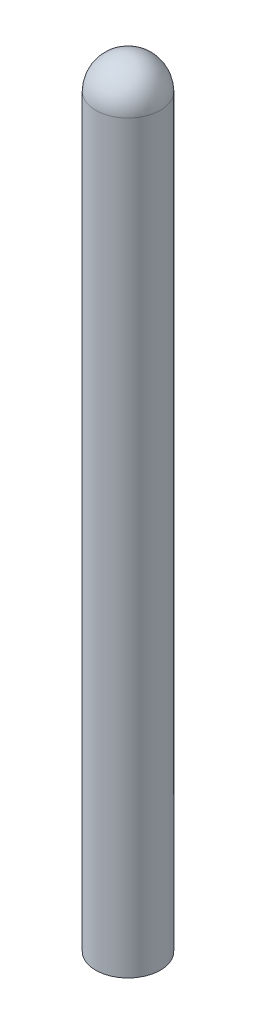
ISO-10303-21;
HEADER;
FILE_DESCRIPTION(('STEP AP214'),'2;1');
FILE_NAME('part.step','',(''),(''),'','','');
FILE_SCHEMA(('AUTOMOTIVE_DESIGN { 1 0 10303 214 1 1 1 1 }'));
ENDSEC;
DATA;
#1=APPLICATION_CONTEXT('core data for automotive mechanical design processes');
#2=APPLICATION_PROTOCOL_DEFINITION('international standard','automotive_design',2000,#1);
#3=PRODUCT_CONTEXT('',#1,'mechanical');
#4=PRODUCT('Part','Part','',(#3));
#5=PRODUCT_RELATED_PRODUCT_CATEGORY('part','',(#4));
#6=PRODUCT_DEFINITION_FORMATION('','',#4);
#7=PRODUCT_DEFINITION_CONTEXT('part definition',#1,'design');
#8=PRODUCT_DEFINITION('design','',#6,#7);
#9=PRODUCT_DEFINITION_SHAPE('','',#8);
#10=(LENGTH_UNIT() NAMED_UNIT(*) SI_UNIT(.MILLI.,.METRE.));
#11=(NAMED_UNIT(*) PLANE_ANGLE_UNIT() SI_UNIT($,.RADIAN.));
#12=(NAMED_UNIT(*) SI_UNIT($,.STERADIAN.) SOLID_ANGLE_UNIT());
#13=UNCERTAINTY_MEASURE_WITH_UNIT(LENGTH_MEASURE(1.E-05),#10,'distance_accuracy_value','');
#14=(GEOMETRIC_REPRESENTATION_CONTEXT(3) GLOBAL_UNCERTAINTY_ASSIGNED_CONTEXT((#13)) GLOBAL_UNIT_ASSIGNED_CONTEXT((#10,
#11,#12)) REPRESENTATION_CONTEXT('',''));
#15=CARTESIAN_POINT('',(0.,0.,0.));
#16=DIRECTION('',(0.,0.,1.));
#17=DIRECTION('',(1.,0.,0.));
#18=AXIS2_PLACEMENT_3D('',#15,#16,#17);
#19=CARTESIAN_POINT('',(0.,76.2,0.));
#20=DIRECTION('',(0.,-1.,0.));
#21=DIRECTION('',(0.,0.,-1.));
#22=AXIS2_PLACEMENT_3D('',#19,#20,#21);
#23=CYLINDRICAL_SURFACE('',#22,3.175);
#24=CARTESIAN_POINT('',(0.,73.025,0.));
#25=DIRECTION('',(0.,-1.,0.));
#26=DIRECTION('',(0.,0.,-1.));
#27=AXIS2_PLACEMENT_3D('',#24,#25,#26);
#28=CIRCLE('',#27,3.175);
#29=CARTESIAN_POINT('',(0.,73.025,-3.175));
#30=VERTEX_POINT('',#29);
#31=EDGE_CURVE('E10',#30,#30,#28,.T.);
#32=CARTESIAN_POINT('',(0.,0.,0.));
#33=DIRECTION('',(0.,1.,0.));
#34=DIRECTION('',(0.,0.,1.));
#35=AXIS2_PLACEMENT_3D('',#32,#33,#34);
#36=CIRCLE('',#35,3.175);
#37=CARTESIAN_POINT('',(0.,0.,-3.175));
#38=VERTEX_POINT('',#37);
#39=EDGE_CURVE('E38',#38,#38,#36,.T.);
#40=CARTESIAN_POINT('',(0.,73.025,-3.175));
#41=CARTESIAN_POINT('',(0.,72.2643229166667,-3.175));
#42=CARTESIAN_POINT('',(0.,71.5036458333334,-3.175));
#43=CARTESIAN_POINT('',(0.,69.9822916666667,-3.175));
#44=CARTESIAN_POINT('',(0.,69.2216145833333,-3.175));
#45=CARTESIAN_POINT('',(0.,67.7002604166667,-3.175));
#46=CARTESIAN_POINT('',(0.,66.9395833333333,-3.175));
#47=CARTESIAN_POINT('',(0.,65.4182291666667,-3.175));
#48=CARTESIAN_POINT('',(0.,64.6575520833333,-3.175));
#49=CARTESIAN_POINT('',(0.,63.1361979166667,-3.175));
#50=CARTESIAN_POINT('',(0.,62.3755208333333,-3.175));
#51=CARTESIAN_POINT('',(0.,60.8541666666667,-3.175));
#52=CARTESIAN_POINT('',(0.,60.0934895833333,-3.175));
#53=CARTESIAN_POINT('',(0.,58.5721354166667,-3.175));
#54=CARTESIAN_POINT('',(0.,57.8114583333333,-3.175));
#55=CARTESIAN_POINT('',(0.,56.2901041666667,-3.175));
#56=CARTESIAN_POINT('',(0.,55.5294270833333,-3.175));
#57=CARTESIAN_POINT('',(0.,54.0080729166667,-3.175));
#58=CARTESIAN_POINT('',(0.,53.2473958333333,-3.175));
#59=CARTESIAN_POINT('',(0.,51.7260416666667,-3.175));
#60=CARTESIAN_POINT('',(0.,50.9653645833333,-3.175));
#61=CARTESIAN_POINT('',(0.,49.4440104166667,-3.175));
#62=CARTESIAN_POINT('',(0.,48.6833333333333,-3.175));
#63=CARTESIAN_POINT('',(0.,47.1619791666667,-3.175));
#64=CARTESIAN_POINT('',(0.,46.4013020833333,-3.175));
#65=CARTESIAN_POINT('',(0.,44.8799479166667,-3.175));
#66=CARTESIAN_POINT('',(0.,44.1192708333333,-3.175));
#67=CARTESIAN_POINT('',(0.,42.5979166666667,-3.175));
#68=CARTESIAN_POINT('',(0.,41.8372395833333,-3.175));
#69=CARTESIAN_POINT('',(0.,40.3158854166667,-3.175));
#70=CARTESIAN_POINT('',(0.,39.5552083333333,-3.175));
#71=CARTESIAN_POINT('',(0.,38.0338541666667,-3.175));
#72=CARTESIAN_POINT('',(0.,37.2731770833333,-3.175));
#73=CARTESIAN_POINT('',(0.,35.7518229166667,-3.175));
#74=CARTESIAN_POINT('',(0.,34.9911458333333,-3.175));
#75=CARTESIAN_POINT('',(0.,33.4697916666667,-3.175));
#76=CARTESIAN_POINT('',(0.,32.7091145833333,-3.175));
#77=CARTESIAN_POINT('',(0.,31.1877604166667,-3.175));
#78=CARTESIAN_POINT('',(0.,30.4270833333333,-3.175));
#79=CARTESIAN_POINT('',(0.,28.9057291666667,-3.175));
#80=CARTESIAN_POINT('',(0.,28.1450520833333,-3.175));
#81=CARTESIAN_POINT('',(0.,26.6236979166667,-3.175));
#82=CARTESIAN_POINT('',(0.,25.8630208333333,-3.175));
#83=CARTESIAN_POINT('',(0.,24.3416666666667,-3.175));
#84=CARTESIAN_POINT('',(0.,23.5809895833333,-3.175));
#85=CARTESIAN_POINT('',(0.,22.0596354166667,-3.175));
#86=CARTESIAN_POINT('',(0.,21.2989583333333,-3.175));
#87=CARTESIAN_POINT('',(0.,19.7776041666667,-3.175));
#88=CARTESIAN_POINT('',(0.,19.0169270833333,-3.175));
#89=CARTESIAN_POINT('',(0.,17.4955729166667,-3.175));
#90=CARTESIAN_POINT('',(0.,16.7348958333333,-3.175));
#91=CARTESIAN_POINT('',(0.,15.2135416666667,-3.175));
#92=CARTESIAN_POINT('',(0.,14.4528645833333,-3.175));
#93=CARTESIAN_POINT('',(0.,12.9315104166667,-3.175));
#94=CARTESIAN_POINT('',(0.,12.1708333333333,-3.175));
#95=CARTESIAN_POINT('',(0.,10.6494791666667,-3.175));
#96=CARTESIAN_POINT('',(0.,9.88880208333332,-3.175));
#97=CARTESIAN_POINT('',(0.,8.36744791666666,-3.175));
#98=CARTESIAN_POINT('',(0.,7.60677083333333,-3.175));
#99=CARTESIAN_POINT('',(0.,6.08541666666667,-3.175));
#100=CARTESIAN_POINT('',(0.,5.32473958333333,-3.175));
#101=CARTESIAN_POINT('',(0.,3.80338541666666,-3.175));
#102=CARTESIAN_POINT('',(0.,3.04270833333332,-3.175));
#103=CARTESIAN_POINT('',(0.,1.52135416666666,-3.175));
#104=CARTESIAN_POINT('',(0.,0.760677083333328,-3.175));
#105=CARTESIAN_POINT('',(0.,0.,-3.175));
#106=B_SPLINE_CURVE_WITH_KNOTS('',3,(#40,#41,#42,#43,#44,#45,#46,#47,#48,#49,#50,#51,#52,#53,
#54,#55,#56,#57,#58,#59,#60,#61,#62,#63,#64,#65,#66,#67,#68,#69,#70,#71,#72,#73,#74,#75,#76,#77,
#78,#79,#80,#81,#82,#83,#84,#85,#86,#87,#88,#89,#90,#91,#92,#93,#94,#95,#96,#97,#98,#99,#100,
#101,#102,#103,#104,#105),.UNSPECIFIED.,.F.,.F.,(4,2,2,2,2,2,2,2,2,2,2,2,2,2,2,2,2,2,2,2,2,2,2,
2,2,2,2,2,2,2,2,2,4),(0.,2.28203125000001,4.56406250000001,6.84609375,9.12812500000001,
11.41015625,13.6921875,15.97421875,18.25625,20.53828125,22.8203125,25.10234375,27.384375,
29.66640625,31.9484375,34.23046875,36.5125,38.79453125,41.0765625,43.35859375,45.640625,
47.92265625,50.2046875,52.48671875,54.76875,57.05078125,59.3328125,61.61484375,63.896875,
66.17890625,68.4609375,70.74296875,73.025),.UNSPECIFIED.);
#107=EDGE_CURVE('BSEAM31',#30,#38,#106,.T.);
#108=ORIENTED_EDGE('',*,*,#31,.T.);
#109=ORIENTED_EDGE('',*,*,#39,.T.);
#110=ORIENTED_EDGE('',*,*,#107,.T.);
#111=ORIENTED_EDGE('',*,*,#107,.F.);
#112=EDGE_LOOP('',(#108,#110,#109,#111));
#113=FACE_BOUND('',#112,.T.);
#114=ADVANCED_FACE('F31',(#113),#23,.T.);
#115=CARTESIAN_POINT('',(0.,0.,0.));
#116=DIRECTION('',(0.,1.,0.));
#117=DIRECTION('',(0.,0.,1.));
#118=AXIS2_PLACEMENT_3D('',#115,#116,#117);
#119=PLANE('',#118);
#120=ORIENTED_EDGE('',*,*,#39,.F.);
#121=EDGE_LOOP('',(#120));
#122=FACE_BOUND('',#121,.T.);
#123=ADVANCED_FACE('F45',(#122),#119,.F.);
#124=CARTESIAN_POINT('',(0.,73.025,0.));
#125=DIRECTION('',(0.,0.,1.));
#126=DIRECTION('',(1.,0.,0.));
#127=AXIS2_PLACEMENT_3D('',#124,#125,#126);
#128=SPHERICAL_SURFACE('',#127,3.175);
#129=CARTESIAN_POINT('',(0.,73.025,0.));
#130=DIRECTION('',(0.,-1.,0.));
#131=DIRECTION('',(0.,0.,-1.));
#132=AXIS2_PLACEMENT_3D('',#129,#130,#131);
#133=SPHERICAL_SURFACE('',#132,3.175);
#134=ORIENTED_EDGE('',*,*,#31,.F.);
#135=EDGE_LOOP('',(#134));
#136=FACE_BOUND('',#135,.T.);
#137=ADVANCED_FACE('F33',(#136),#133,.T.);
#138=CLOSED_SHELL('',(#114,#123,#137));
#139=MANIFOLD_SOLID_BREP('B2',#138);
#140=ADVANCED_BREP_SHAPE_REPRESENTATION('',(#18,#139),#14);
#141=SHAPE_DEFINITION_REPRESENTATION(#9,#140);
ENDSEC;
END-ISO-10303-21;
